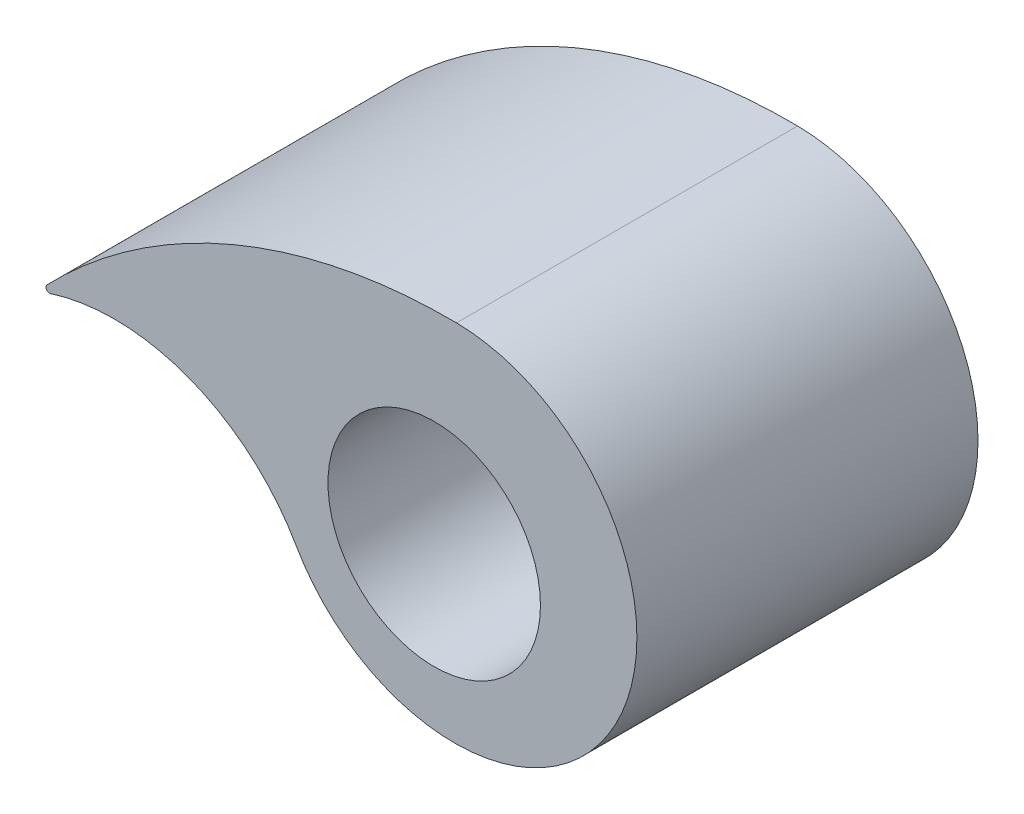
ISO-10303-21;
HEADER;
FILE_DESCRIPTION(('STEP AP214'),'2;1');
FILE_NAME('part.step','',(''),(''),'','','');
FILE_SCHEMA(('AUTOMOTIVE_DESIGN { 1 0 10303 214 1 1 1 1 }'));
ENDSEC;
DATA;
#1=APPLICATION_CONTEXT('core data for automotive mechanical design processes');
#2=APPLICATION_PROTOCOL_DEFINITION('international standard','automotive_design',2000,#1);
#3=PRODUCT_CONTEXT('',#1,'mechanical');
#4=PRODUCT('Part','Part','',(#3));
#5=PRODUCT_RELATED_PRODUCT_CATEGORY('part','',(#4));
#6=PRODUCT_DEFINITION_FORMATION('','',#4);
#7=PRODUCT_DEFINITION_CONTEXT('part definition',#1,'design');
#8=PRODUCT_DEFINITION('design','',#6,#7);
#9=PRODUCT_DEFINITION_SHAPE('','',#8);
#10=(LENGTH_UNIT() NAMED_UNIT(*) SI_UNIT(.MILLI.,.METRE.));
#11=(NAMED_UNIT(*) PLANE_ANGLE_UNIT() SI_UNIT($,.RADIAN.));
#12=(NAMED_UNIT(*) SI_UNIT($,.STERADIAN.) SOLID_ANGLE_UNIT());
#13=UNCERTAINTY_MEASURE_WITH_UNIT(LENGTH_MEASURE(1.E-05),#10,'distance_accuracy_value','');
#14=(GEOMETRIC_REPRESENTATION_CONTEXT(3) GLOBAL_UNCERTAINTY_ASSIGNED_CONTEXT((#13)) GLOBAL_UNIT_ASSIGNED_CONTEXT((#10,
#11,#12)) REPRESENTATION_CONTEXT('',''));
#15=CARTESIAN_POINT('',(0.,0.,0.));
#16=DIRECTION('',(0.,0.,1.));
#17=DIRECTION('',(1.,0.,0.));
#18=AXIS2_PLACEMENT_3D('',#15,#16,#17);
#19=CARTESIAN_POINT('',(5.51979411848108,-13.9474683326252,-24.4));
#20=DIRECTION('',(0.,0.,1.));
#21=DIRECTION('',(1.,0.,0.));
#22=AXIS2_PLACEMENT_3D('',#19,#20,#21);
#23=CYLINDRICAL_SURFACE('',#22,15.);
#24=CARTESIAN_POINT('',(5.51979411848108,-13.9474683326252,0.));
#25=DIRECTION('',(0.,0.,-1.));
#26=DIRECTION('',(1.,0.,0.));
#27=AXIS2_PLACEMENT_3D('',#24,#25,#26);
#28=CIRCLE('',#27,15.);
#29=CARTESIAN_POINT('',(0.962473770466765,0.343466949768875,0.));
#30=VERTEX_POINT('',#29);
#31=CARTESIAN_POINT('',(18.5340245134648,-6.48892911731758,0.));
#32=VERTEX_POINT('',#31);
#33=EDGE_CURVE('E114',#30,#32,#28,.T.);
#34=ORIENTED_EDGE('',*,*,#33,.F.);
#35=DIRECTION('',(0.,0.,1.));
#36=VECTOR('',#35,1.);
#37=CARTESIAN_POINT('',(0.962473770466765,0.343466949768875,-24.4));
#38=LINE('',#37,#36);
#39=CARTESIAN_POINT('',(0.962473770466765,0.343466949768875,-24.4));
#40=VERTEX_POINT('',#39);
#41=EDGE_CURVE('E13',#40,#30,#38,.T.);
#42=ORIENTED_EDGE('',*,*,#41,.F.);
#43=CARTESIAN_POINT('',(5.51979411848108,-13.9474683326252,-24.4));
#44=DIRECTION('',(0.,0.,-1.));
#45=DIRECTION('',(1.,0.,0.));
#46=AXIS2_PLACEMENT_3D('',#43,#44,#45);
#47=CIRCLE('',#46,15.);
#48=CARTESIAN_POINT('',(18.5340245134648,-6.48892911731758,-24.4));
#49=VERTEX_POINT('',#48);
#50=EDGE_CURVE('E107',#40,#49,#47,.T.);
#51=ORIENTED_EDGE('',*,*,#50,.T.);
#52=DIRECTION('',(0.,0.,1.));
#53=VECTOR('',#52,1.);
#54=CARTESIAN_POINT('',(18.5340245134648,-6.48892911731758,-24.4));
#55=LINE('',#54,#53);
#56=EDGE_CURVE('E52',#49,#32,#55,.T.);
#57=ORIENTED_EDGE('',*,*,#56,.T.);
#58=EDGE_LOOP('',(#34,#42,#51,#57));
#59=FACE_BOUND('',#58,.T.);
#60=ADVANCED_FACE('F49',(#59),#23,.F.);
#61=CARTESIAN_POINT('',(0.886518431333192,0.581649204475444,-24.4));
#62=DIRECTION('',(0.,0.,1.));
#63=DIRECTION('',(1.,0.,0.));
#64=AXIS2_PLACEMENT_3D('',#61,#62,#63);
#65=CYLINDRICAL_SURFACE('',#64,0.250000000000002);
#66=CARTESIAN_POINT('',(0.886518431333192,0.581649204475444,0.));
#67=DIRECTION('',(0.,0.,1.));
#68=DIRECTION('',(-1.,0.,0.));
#69=AXIS2_PLACEMENT_3D('',#66,#67,#68);
#70=CIRCLE('',#69,0.250000000000002);
#71=CARTESIAN_POINT('',(0.706182937583885,0.754793969612002,0.));
#72=VERTEX_POINT('',#71);
#73=EDGE_CURVE('E109',#72,#30,#70,.T.);
#74=ORIENTED_EDGE('',*,*,#73,.F.);
#75=DIRECTION('',(0.,0.,1.));
#76=VECTOR('',#75,1.);
#77=CARTESIAN_POINT('',(0.706182937583885,0.754793969612002,-24.4));
#78=LINE('',#77,#76);
#79=CARTESIAN_POINT('',(0.706182937583885,0.754793969612002,-24.4));
#80=VERTEX_POINT('',#79);
#81=EDGE_CURVE('E58',#80,#72,#78,.T.);
#82=ORIENTED_EDGE('',*,*,#81,.F.);
#83=CARTESIAN_POINT('',(0.886518431333192,0.581649204475444,-24.4));
#84=DIRECTION('',(0.,0.,1.));
#85=DIRECTION('',(-1.,0.,0.));
#86=AXIS2_PLACEMENT_3D('',#83,#84,#85);
#87=CIRCLE('',#86,0.250000000000002);
#88=EDGE_CURVE('E104',#80,#40,#87,.T.);
#89=ORIENTED_EDGE('',*,*,#88,.T.);
#90=ORIENTED_EDGE('',*,*,#41,.T.);
#91=EDGE_LOOP('',(#74,#82,#89,#90));
#92=FACE_BOUND('',#91,.T.);
#93=ADVANCED_FACE('F125',(#92),#65,.T.);
#94=CARTESIAN_POINT('',(29.5598619374734,-26.9483684522368,-24.4));
#95=DIRECTION('',(0.,0.,1.));
#96=DIRECTION('',(1.,0.,0.));
#97=AXIS2_PLACEMENT_3D('',#94,#95,#96);
#98=CYLINDRICAL_SURFACE('',#97,40.);
#99=CARTESIAN_POINT('',(29.5598619374734,-26.9483684522368,0.));
#100=DIRECTION('',(0.,0.,1.));
#101=DIRECTION('',(1.,0.,0.));
#102=AXIS2_PLACEMENT_3D('',#99,#100,#101);
#103=CIRCLE('',#102,40.);
#104=CARTESIAN_POINT('',(30.,13.0492099555358,0.));
#105=VERTEX_POINT('',#104);
#106=EDGE_CURVE('E99',#105,#72,#103,.T.);
#107=ORIENTED_EDGE('',*,*,#106,.F.);
#108=DIRECTION('',(0.,0.,1.));
#109=VECTOR('',#108,1.);
#110=CARTESIAN_POINT('',(30.,13.0492099555358,-24.4));
#111=LINE('',#110,#109);
#112=CARTESIAN_POINT('',(30.,13.0492099555358,-24.4));
#113=VERTEX_POINT('',#112);
#114=EDGE_CURVE('E94',#113,#105,#111,.T.);
#115=ORIENTED_EDGE('',*,*,#114,.F.);
#116=CARTESIAN_POINT('',(29.5598619374734,-26.9483684522368,-24.4));
#117=DIRECTION('',(0.,0.,1.));
#118=DIRECTION('',(1.,0.,0.));
#119=AXIS2_PLACEMENT_3D('',#116,#117,#118);
#120=CIRCLE('',#119,40.);
#121=EDGE_CURVE('E97',#113,#80,#120,.T.);
#122=ORIENTED_EDGE('',*,*,#121,.T.);
#123=ORIENTED_EDGE('',*,*,#81,.T.);
#124=EDGE_LOOP('',(#107,#115,#122,#123));
#125=FACE_BOUND('',#124,.T.);
#126=ADVANCED_FACE('F96',(#125),#98,.T.);
#127=CARTESIAN_POINT('',(29.8564049571007,0.,-24.4));
#128=DIRECTION('',(0.,0.,1.));
#129=DIRECTION('',(1.,0.,0.));
#130=AXIS2_PLACEMENT_3D('',#127,#128,#129);
#131=CYLINDRICAL_SURFACE('',#130,13.05);
#132=CARTESIAN_POINT('',(29.8564049571007,0.,0.));
#133=DIRECTION('',(0.,0.,1.));
#134=DIRECTION('',(1.,0.,0.));
#135=AXIS2_PLACEMENT_3D('',#132,#133,#134);
#136=CIRCLE('',#135,13.05);
#137=EDGE_CURVE('E117',#32,#105,#136,.T.);
#138=ORIENTED_EDGE('',*,*,#137,.F.);
#139=ORIENTED_EDGE('',*,*,#56,.F.);
#140=CARTESIAN_POINT('',(29.8564049571007,0.,-24.4));
#141=DIRECTION('',(0.,0.,1.));
#142=DIRECTION('',(1.,0.,0.));
#143=AXIS2_PLACEMENT_3D('',#140,#141,#142);
#144=CIRCLE('',#143,13.05);
#145=EDGE_CURVE('E103',#49,#113,#144,.T.);
#146=ORIENTED_EDGE('',*,*,#145,.T.);
#147=ORIENTED_EDGE('',*,*,#114,.T.);
#148=EDGE_LOOP('',(#138,#139,#146,#147));
#149=FACE_BOUND('',#148,.T.);
#150=ADVANCED_FACE('F106',(#149),#131,.T.);
#151=CARTESIAN_POINT('',(3.20315627490714,-6.68290956407486,-24.4));
#152=DIRECTION('',(0.,0.,1.));
#153=DIRECTION('',(1.,0.,0.));
#154=AXIS2_PLACEMENT_3D('',#151,#152,#153);
#155=PLANE('',#154);
#156=CARTESIAN_POINT('',(28.4068360556683,-1.44956890143244,-24.4));
#157=DIRECTION('',(0.,0.,1.));
#158=DIRECTION('',(1.,0.,0.));
#159=AXIS2_PLACEMENT_3D('',#156,#157,#158);
#160=CIRCLE('',#159,7.59999999999998);
#161=CARTESIAN_POINT('',(36.0068360556683,-1.44956890143244,-24.4));
#162=VERTEX_POINT('',#161);
#163=EDGE_CURVE('E118',#162,#162,#160,.T.);
#164=ORIENTED_EDGE('',*,*,#163,.T.);
#165=EDGE_LOOP('',(#164));
#166=FACE_BOUND('',#165,.T.);
#167=ORIENTED_EDGE('',*,*,#50,.F.);
#168=ORIENTED_EDGE('',*,*,#88,.F.);
#169=ORIENTED_EDGE('',*,*,#121,.F.);
#170=ORIENTED_EDGE('',*,*,#145,.F.);
#171=EDGE_LOOP('',(#167,#168,#169,#170));
#172=FACE_BOUND('',#171,.T.);
#173=ADVANCED_FACE('F102',(#166,#172),#155,.F.);
#174=CARTESIAN_POINT('',(3.20315627490714,-6.68290956407486,0.));
#175=DIRECTION('',(0.,0.,1.));
#176=DIRECTION('',(1.,0.,0.));
#177=AXIS2_PLACEMENT_3D('',#174,#175,#176);
#178=PLANE('',#177);
#179=CARTESIAN_POINT('',(28.4068360556683,-1.44956890143244,0.));
#180=DIRECTION('',(0.,0.,1.));
#181=DIRECTION('',(1.,0.,0.));
#182=AXIS2_PLACEMENT_3D('',#179,#180,#181);
#183=CIRCLE('',#182,7.59999999999998);
#184=CARTESIAN_POINT('',(36.0068360556683,-1.44956890143244,0.));
#185=VERTEX_POINT('',#184);
#186=EDGE_CURVE('E155',#185,#185,#183,.T.);
#187=ORIENTED_EDGE('',*,*,#186,.F.);
#188=EDGE_LOOP('',(#187));
#189=FACE_BOUND('',#188,.T.);
#190=ORIENTED_EDGE('',*,*,#33,.T.);
#191=ORIENTED_EDGE('',*,*,#137,.T.);
#192=ORIENTED_EDGE('',*,*,#106,.T.);
#193=ORIENTED_EDGE('',*,*,#73,.T.);
#194=EDGE_LOOP('',(#190,#191,#192,#193));
#195=FACE_BOUND('',#194,.T.);
#196=ADVANCED_FACE('F124',(#189,#195),#178,.T.);
#197=CARTESIAN_POINT('',(28.4068360556683,-1.44956890143244,-24.4));
#198=DIRECTION('',(0.,0.,1.));
#199=DIRECTION('',(1.,0.,0.));
#200=AXIS2_PLACEMENT_3D('',#197,#198,#199);
#201=CYLINDRICAL_SURFACE('',#200,7.59999999999998);
#202=ORIENTED_EDGE('',*,*,#163,.F.);
#203=EDGE_LOOP('',(#202));
#204=FACE_BOUND('',#203,.T.);
#205=ORIENTED_EDGE('',*,*,#186,.T.);
#206=EDGE_LOOP('',(#205));
#207=FACE_BOUND('',#206,.T.);
#208=ADVANCED_FACE('F143',(#204,#207),#201,.F.);
#209=CLOSED_SHELL('',(#60,#93,#126,#150,#173,#196,#208));
#210=MANIFOLD_SOLID_BREP('B2',#209);
#211=ADVANCED_BREP_SHAPE_REPRESENTATION('',(#18,#210),#14);
#212=SHAPE_DEFINITION_REPRESENTATION(#9,#211);
ENDSEC;
END-ISO-10303-21;
